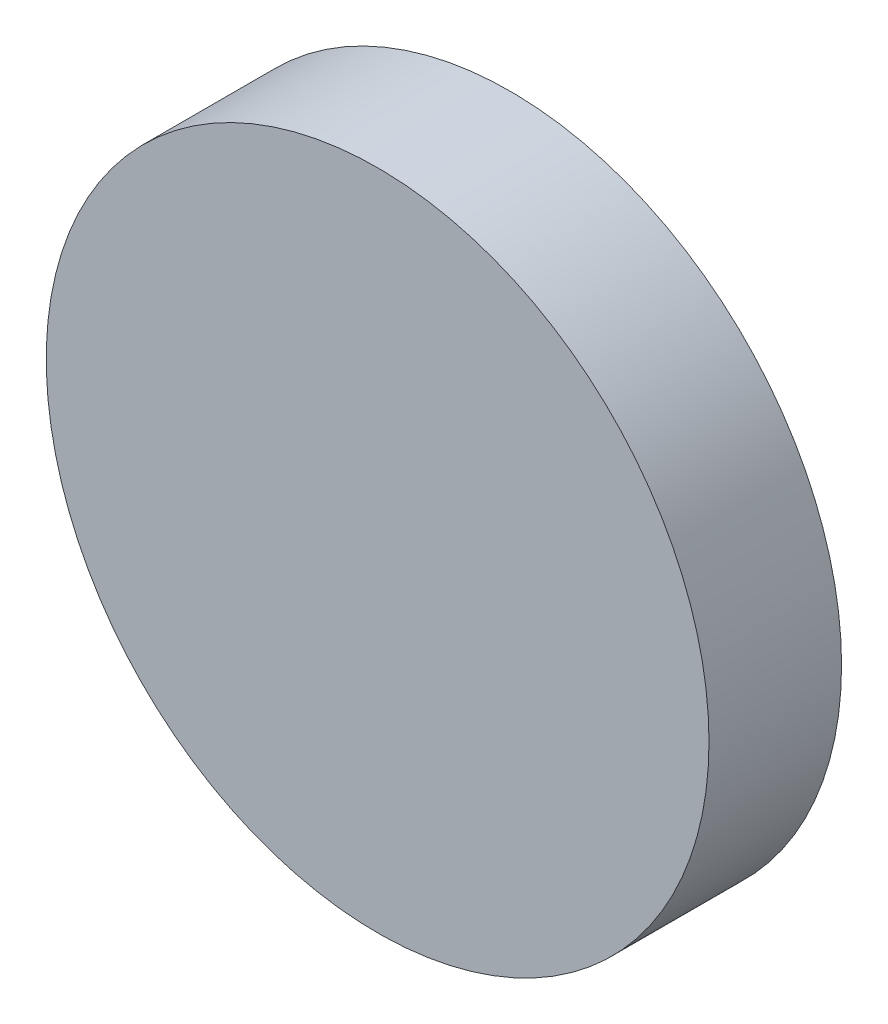
ISO-10303-21;
HEADER;
FILE_DESCRIPTION(('STEP AP214'),'2;1');
FILE_NAME('part.step','',(''),(''),'','','');
FILE_SCHEMA(('AUTOMOTIVE_DESIGN { 1 0 10303 214 1 1 1 1 }'));
ENDSEC;
DATA;
#1=APPLICATION_CONTEXT('core data for automotive mechanical design processes');
#2=APPLICATION_PROTOCOL_DEFINITION('international standard','automotive_design',2000,#1);
#3=PRODUCT_CONTEXT('',#1,'mechanical');
#4=PRODUCT('Part','Part','',(#3));
#5=PRODUCT_RELATED_PRODUCT_CATEGORY('part','',(#4));
#6=PRODUCT_DEFINITION_FORMATION('','',#4);
#7=PRODUCT_DEFINITION_CONTEXT('part definition',#1,'design');
#8=PRODUCT_DEFINITION('design','',#6,#7);
#9=PRODUCT_DEFINITION_SHAPE('','',#8);
#10=(LENGTH_UNIT() NAMED_UNIT(*) SI_UNIT(.MILLI.,.METRE.));
#11=(NAMED_UNIT(*) PLANE_ANGLE_UNIT() SI_UNIT($,.RADIAN.));
#12=(NAMED_UNIT(*) SI_UNIT($,.STERADIAN.) SOLID_ANGLE_UNIT());
#13=UNCERTAINTY_MEASURE_WITH_UNIT(LENGTH_MEASURE(1.E-05),#10,'distance_accuracy_value','');
#14=(GEOMETRIC_REPRESENTATION_CONTEXT(3) GLOBAL_UNCERTAINTY_ASSIGNED_CONTEXT((#13)) GLOBAL_UNIT_ASSIGNED_CONTEXT((#10,
#11,#12)) REPRESENTATION_CONTEXT('',''));
#15=CARTESIAN_POINT('',(0.,0.,0.));
#16=DIRECTION('',(0.,0.,1.));
#17=DIRECTION('',(1.,0.,0.));
#18=AXIS2_PLACEMENT_3D('',#15,#16,#17);
#19=CARTESIAN_POINT('',(0.,0.,5.));
#20=DIRECTION('',(0.,0.,-1.));
#21=DIRECTION('',(-1.,0.,0.));
#22=AXIS2_PLACEMENT_3D('',#19,#20,#21);
#23=CYLINDRICAL_SURFACE('',#22,12.5);
#24=CARTESIAN_POINT('',(0.,0.,5.));
#25=DIRECTION('',(0.,0.,1.));
#26=DIRECTION('',(1.,0.,0.));
#27=AXIS2_PLACEMENT_3D('',#24,#25,#26);
#28=CIRCLE('',#27,12.5);
#29=CARTESIAN_POINT('',(12.5,0.,5.));
#30=VERTEX_POINT('',#29);
#31=EDGE_CURVE('E10',#30,#30,#28,.T.);
#32=ORIENTED_EDGE('',*,*,#31,.F.);
#33=EDGE_LOOP('',(#32));
#34=FACE_BOUND('',#33,.T.);
#35=CARTESIAN_POINT('',(0.,0.,0.));
#36=DIRECTION('',(0.,0.,1.));
#37=DIRECTION('',(1.,0.,0.));
#38=AXIS2_PLACEMENT_3D('',#35,#36,#37);
#39=CIRCLE('',#38,12.5);
#40=CARTESIAN_POINT('',(12.5,0.,0.));
#41=VERTEX_POINT('',#40);
#42=EDGE_CURVE('E40',#41,#41,#39,.T.);
#43=ORIENTED_EDGE('',*,*,#42,.T.);
#44=EDGE_LOOP('',(#43));
#45=FACE_BOUND('',#44,.T.);
#46=ADVANCED_FACE('F37',(#34,#45),#23,.T.);
#47=CARTESIAN_POINT('',(0.,0.,5.));
#48=DIRECTION('',(0.,0.,1.));
#49=DIRECTION('',(1.,0.,0.));
#50=AXIS2_PLACEMENT_3D('',#47,#48,#49);
#51=PLANE('',#50);
#52=ORIENTED_EDGE('',*,*,#31,.T.);
#53=EDGE_LOOP('',(#52));
#54=FACE_BOUND('',#53,.T.);
#55=ADVANCED_FACE('F54',(#54),#51,.T.);
#56=CARTESIAN_POINT('',(0.,0.,0.));
#57=DIRECTION('',(0.,0.,1.));
#58=DIRECTION('',(1.,0.,0.));
#59=AXIS2_PLACEMENT_3D('',#56,#57,#58);
#60=PLANE('',#59);
#61=ORIENTED_EDGE('',*,*,#42,.F.);
#62=EDGE_LOOP('',(#61));
#63=FACE_BOUND('',#62,.T.);
#64=ADVANCED_FACE('F52',(#63),#60,.F.);
#65=CLOSED_SHELL('',(#46,#55,#64));
#66=MANIFOLD_SOLID_BREP('B2',#65);
#67=ADVANCED_BREP_SHAPE_REPRESENTATION('',(#18,#66),#14);
#68=SHAPE_DEFINITION_REPRESENTATION(#9,#67);
ENDSEC;
END-ISO-10303-21;
